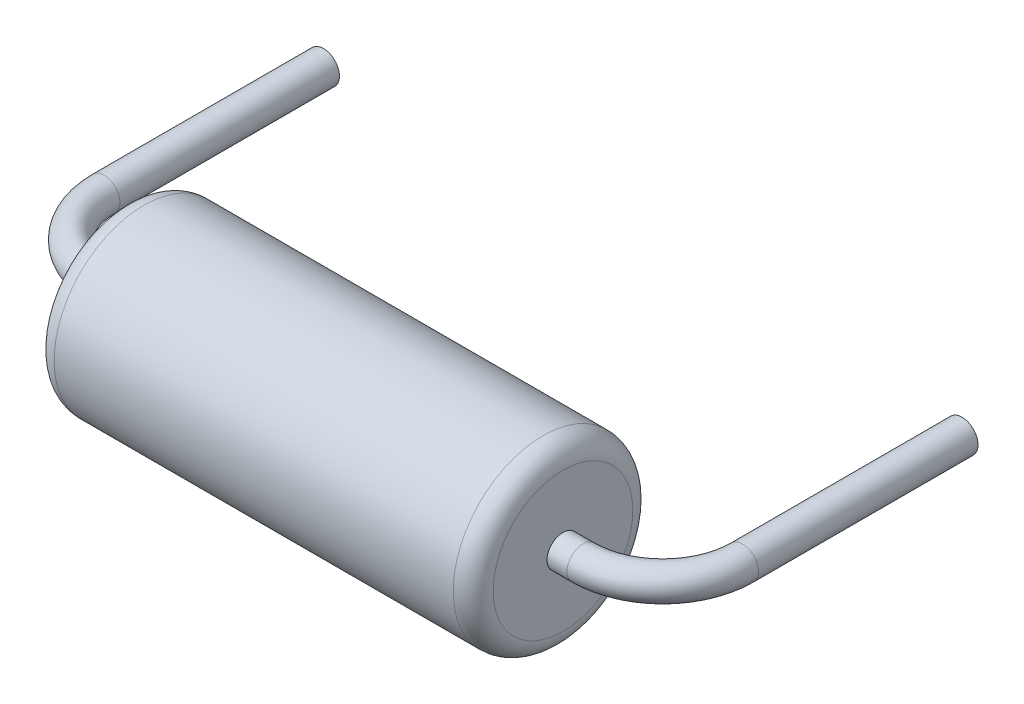
ISO-10303-21;
HEADER;
FILE_DESCRIPTION(('STEP AP214'),'2;1');
FILE_NAME('part.step','',(''),(''),'','','');
FILE_SCHEMA(('AUTOMOTIVE_DESIGN { 1 0 10303 214 1 1 1 1 }'));
ENDSEC;
DATA;
#1=APPLICATION_CONTEXT('core data for automotive mechanical design processes');
#2=APPLICATION_PROTOCOL_DEFINITION('international standard','automotive_design',2000,#1);
#3=PRODUCT_CONTEXT('',#1,'mechanical');
#4=PRODUCT('Part','Part','',(#3));
#5=PRODUCT_RELATED_PRODUCT_CATEGORY('part','',(#4));
#6=PRODUCT_DEFINITION_FORMATION('','',#4);
#7=PRODUCT_DEFINITION_CONTEXT('part definition',#1,'design');
#8=PRODUCT_DEFINITION('design','',#6,#7);
#9=PRODUCT_DEFINITION_SHAPE('','',#8);
#10=(LENGTH_UNIT() NAMED_UNIT(*) SI_UNIT(.MILLI.,.METRE.));
#11=(NAMED_UNIT(*) PLANE_ANGLE_UNIT() SI_UNIT($,.RADIAN.));
#12=(NAMED_UNIT(*) SI_UNIT($,.STERADIAN.) SOLID_ANGLE_UNIT());
#13=UNCERTAINTY_MEASURE_WITH_UNIT(LENGTH_MEASURE(1.E-05),#10,'distance_accuracy_value','');
#14=(GEOMETRIC_REPRESENTATION_CONTEXT(3) GLOBAL_UNCERTAINTY_ASSIGNED_CONTEXT((#13)) GLOBAL_UNIT_ASSIGNED_CONTEXT((#10,
#11,#12)) REPRESENTATION_CONTEXT('',''));
#15=CARTESIAN_POINT('',(0.,0.,0.));
#16=DIRECTION('',(0.,0.,1.));
#17=DIRECTION('',(1.,0.,0.));
#18=AXIS2_PLACEMENT_3D('',#15,#16,#17);
#19=CARTESIAN_POINT('',(13.5,0.,2.25));
#20=DIRECTION('',(-1.,0.,0.));
#21=DIRECTION('',(0.,0.,1.));
#22=AXIS2_PLACEMENT_3D('',#19,#20,#21);
#23=CYLINDRICAL_SURFACE('',#22,2.25);
#24=CARTESIAN_POINT('',(3.,0.,2.25));
#25=DIRECTION('',(1.,0.,0.));
#26=DIRECTION('',(0.,0.,-1.));
#27=AXIS2_PLACEMENT_3D('',#24,#25,#26);
#28=CIRCLE('',#27,2.25);
#29=CARTESIAN_POINT('',(3.,0.,0.));
#30=VERTEX_POINT('',#29);
#31=EDGE_CURVE('E40',#30,#30,#28,.T.);
#32=ORIENTED_EDGE('',*,*,#31,.T.);
#33=EDGE_LOOP('',(#32));
#34=FACE_BOUND('',#33,.T.);
#35=CARTESIAN_POINT('',(13.,0.,2.25));
#36=DIRECTION('',(1.,0.,0.));
#37=DIRECTION('',(0.,0.,-1.));
#38=AXIS2_PLACEMENT_3D('',#35,#36,#37);
#39=CIRCLE('',#38,2.25);
#40=CARTESIAN_POINT('',(13.,0.,0.));
#41=VERTEX_POINT('',#40);
#42=EDGE_CURVE('E44',#41,#41,#39,.F.);
#43=ORIENTED_EDGE('',*,*,#42,.T.);
#44=EDGE_LOOP('',(#43));
#45=FACE_BOUND('',#44,.T.);
#46=ADVANCED_FACE('F29',(#34,#45),#23,.T.);
#47=CARTESIAN_POINT('',(13.5,0.,2.25));
#48=DIRECTION('',(1.,0.,0.));
#49=DIRECTION('',(0.,0.,-1.));
#50=AXIS2_PLACEMENT_3D('',#47,#48,#49);
#51=PLANE('',#50);
#52=CARTESIAN_POINT('',(13.5,0.,2.25));
#53=DIRECTION('',(1.,0.,0.));
#54=DIRECTION('',(0.,0.,-1.));
#55=AXIS2_PLACEMENT_3D('',#52,#53,#54);
#56=CIRCLE('',#55,1.75);
#57=CARTESIAN_POINT('',(13.5,0.,0.5));
#58=VERTEX_POINT('',#57);
#59=EDGE_CURVE('E10',#58,#58,#56,.T.);
#60=ORIENTED_EDGE('',*,*,#59,.T.);
#61=EDGE_LOOP('',(#60));
#62=FACE_BOUND('',#61,.T.);
#63=CARTESIAN_POINT('',(13.5,0.,2.25));
#64=DIRECTION('',(1.,0.,0.));
#65=DIRECTION('',(0.,0.,-1.));
#66=AXIS2_PLACEMENT_3D('',#63,#64,#65);
#67=CIRCLE('',#66,0.4);
#68=CARTESIAN_POINT('',(13.5,0.,1.85));
#69=VERTEX_POINT('',#68);
#70=EDGE_CURVE('E49',#69,#69,#67,.T.);
#71=ORIENTED_EDGE('',*,*,#70,.F.);
#72=EDGE_LOOP('',(#71));
#73=FACE_BOUND('',#72,.T.);
#74=ADVANCED_FACE('F90',(#62,#73),#51,.T.);
#75=CARTESIAN_POINT('',(2.5,0.,2.25));
#76=DIRECTION('',(1.,0.,0.));
#77=DIRECTION('',(0.,0.,-1.));
#78=AXIS2_PLACEMENT_3D('',#75,#76,#77);
#79=PLANE('',#78);
#80=CARTESIAN_POINT('',(2.5,0.,2.25));
#81=DIRECTION('',(1.,0.,0.));
#82=DIRECTION('',(0.,0.,-1.));
#83=AXIS2_PLACEMENT_3D('',#80,#81,#82);
#84=CIRCLE('',#83,1.75);
#85=CARTESIAN_POINT('',(2.5,0.,0.5));
#86=VERTEX_POINT('',#85);
#87=EDGE_CURVE('E36',#86,#86,#84,.F.);
#88=ORIENTED_EDGE('',*,*,#87,.T.);
#89=EDGE_LOOP('',(#88));
#90=FACE_BOUND('',#89,.T.);
#91=CARTESIAN_POINT('',(2.5,0.,2.25));
#92=DIRECTION('',(1.,0.,0.));
#93=DIRECTION('',(0.,0.,-1.));
#94=AXIS2_PLACEMENT_3D('',#91,#92,#93);
#95=CIRCLE('',#94,0.4);
#96=CARTESIAN_POINT('',(2.5,0.,1.85));
#97=VERTEX_POINT('',#96);
#98=EDGE_CURVE('E50',#97,#97,#95,.T.);
#99=ORIENTED_EDGE('',*,*,#98,.T.);
#100=EDGE_LOOP('',(#99));
#101=FACE_BOUND('',#100,.T.);
#102=ADVANCED_FACE('F85',(#90,#101),#79,.F.);
#103=CARTESIAN_POINT('',(0.,0.,-5.25));
#104=DIRECTION('',(0.,0.,1.));
#105=DIRECTION('',(1.,0.,0.));
#106=AXIS2_PLACEMENT_3D('',#103,#104,#105);
#107=PLANE('',#106);
#108=CARTESIAN_POINT('',(0.,0.,-5.25));
#109=DIRECTION('',(0.,0.,1.));
#110=DIRECTION('',(1.,0.,0.));
#111=AXIS2_PLACEMENT_3D('',#108,#109,#110);
#112=CIRCLE('',#111,0.4);
#113=CARTESIAN_POINT('',(0.4,0.,-5.25));
#114=VERTEX_POINT('',#113);
#115=EDGE_CURVE('E68',#114,#114,#112,.T.);
#116=ORIENTED_EDGE('',*,*,#115,.F.);
#117=EDGE_LOOP('',(#116));
#118=FACE_BOUND('',#117,.T.);
#119=ADVANCED_FACE('F80',(#118),#107,.F.);
#120=CARTESIAN_POINT('',(0.,0.,0.25));
#121=DIRECTION('',(0.,0.,-1.));
#122=DIRECTION('',(-1.,0.,0.));
#123=AXIS2_PLACEMENT_3D('',#120,#121,#122);
#124=CYLINDRICAL_SURFACE('',#123,0.4);
#125=CARTESIAN_POINT('',(0.,0.,0.25));
#126=DIRECTION('',(0.,0.,1.));
#127=DIRECTION('',(1.,0.,0.));
#128=AXIS2_PLACEMENT_3D('',#125,#126,#127);
#129=CIRCLE('',#128,0.4);
#130=CARTESIAN_POINT('',(-0.399999999999999,0.,0.25));
#131=VERTEX_POINT('',#130);
#132=EDGE_CURVE('E67',#131,#131,#129,.T.);
#133=ORIENTED_EDGE('',*,*,#132,.F.);
#134=EDGE_LOOP('',(#133));
#135=FACE_BOUND('',#134,.T.);
#136=ORIENTED_EDGE('',*,*,#115,.T.);
#137=EDGE_LOOP('',(#136));
#138=FACE_BOUND('',#137,.T.);
#139=ADVANCED_FACE('F77',(#135,#138),#124,.T.);
#140=CARTESIAN_POINT('',(2.,0.,0.25));
#141=DIRECTION('',(0.,1.,0.));
#142=DIRECTION('',(0.,0.,1.));
#143=AXIS2_PLACEMENT_3D('',#140,#141,#142);
#144=TOROIDAL_SURFACE('',#143,2.,0.4);
#145=CARTESIAN_POINT('',(2.,0.,2.25));
#146=DIRECTION('',(1.,0.,0.));
#147=DIRECTION('',(0.,0.,-1.));
#148=AXIS2_PLACEMENT_3D('',#145,#146,#147);
#149=CIRCLE('',#148,0.4);
#150=CARTESIAN_POINT('',(2.,0.,2.65));
#151=VERTEX_POINT('',#150);
#152=EDGE_CURVE('E64',#151,#151,#149,.T.);
#153=CARTESIAN_POINT('',(2.,0.,0.25));
#154=DIRECTION('',(0.,1.,0.));
#155=DIRECTION('',(0.,0.,1.));
#156=AXIS2_PLACEMENT_3D('',#153,#154,#155);
#157=CIRCLE('',#156,2.4);
#158=EDGE_CURVE('',#131,#151,#157,.T.);
#159=ORIENTED_EDGE('',*,*,#132,.T.);
#160=ORIENTED_EDGE('',*,*,#152,.F.);
#161=ORIENTED_EDGE('',*,*,#158,.T.);
#162=ORIENTED_EDGE('',*,*,#158,.F.);
#163=EDGE_LOOP('',(#159,#161,#160,#162));
#164=FACE_BOUND('',#163,.T.);
#165=ADVANCED_FACE('F74',(#164),#144,.T.);
#166=CARTESIAN_POINT('',(2.,0.,2.25));
#167=DIRECTION('',(1.,0.,0.));
#168=DIRECTION('',(0.,0.,-1.));
#169=AXIS2_PLACEMENT_3D('',#166,#167,#168);
#170=CYLINDRICAL_SURFACE('',#169,0.4);
#171=ORIENTED_EDGE('',*,*,#152,.T.);
#172=EDGE_LOOP('',(#171));
#173=FACE_BOUND('',#172,.T.);
#174=ORIENTED_EDGE('',*,*,#98,.F.);
#175=EDGE_LOOP('',(#174));
#176=FACE_BOUND('',#175,.T.);
#177=ADVANCED_FACE('F120',(#173,#176),#170,.T.);
#178=CARTESIAN_POINT('',(16.,0.,0.249999999999999));
#179=DIRECTION('',(0.,0.,-1.));
#180=DIRECTION('',(-1.,0.,0.));
#181=AXIS2_PLACEMENT_3D('',#178,#179,#180);
#182=CYLINDRICAL_SURFACE('',#181,0.4);
#183=CARTESIAN_POINT('',(16.,0.,0.249999999999999));
#184=DIRECTION('',(0.,0.,-1.));
#185=DIRECTION('',(-1.,0.,0.));
#186=AXIS2_PLACEMENT_3D('',#183,#184,#185);
#187=CIRCLE('',#186,0.4);
#188=CARTESIAN_POINT('',(16.4,0.,0.249999999999999));
#189=VERTEX_POINT('',#188);
#190=EDGE_CURVE('E58',#189,#189,#187,.T.);
#191=ORIENTED_EDGE('',*,*,#190,.T.);
#192=EDGE_LOOP('',(#191));
#193=FACE_BOUND('',#192,.T.);
#194=CARTESIAN_POINT('',(16.,0.,-5.25));
#195=DIRECTION('',(0.,0.,-1.));
#196=DIRECTION('',(-1.,0.,0.));
#197=AXIS2_PLACEMENT_3D('',#194,#195,#196);
#198=CIRCLE('',#197,0.4);
#199=CARTESIAN_POINT('',(15.6,0.,-5.25));
#200=VERTEX_POINT('',#199);
#201=EDGE_CURVE('E53',#200,#200,#198,.T.);
#202=ORIENTED_EDGE('',*,*,#201,.F.);
#203=EDGE_LOOP('',(#202));
#204=FACE_BOUND('',#203,.T.);
#205=ADVANCED_FACE('F123',(#193,#204),#182,.T.);
#206=CARTESIAN_POINT('',(14.,0.,0.249999999999998));
#207=DIRECTION('',(0.,1.,0.));
#208=DIRECTION('',(0.,0.,1.));
#209=AXIS2_PLACEMENT_3D('',#206,#207,#208);
#210=TOROIDAL_SURFACE('',#209,2.,0.4);
#211=CARTESIAN_POINT('',(14.,0.,2.25));
#212=DIRECTION('',(1.,0.,0.));
#213=DIRECTION('',(0.,0.,-1.));
#214=AXIS2_PLACEMENT_3D('',#211,#212,#213);
#215=CIRCLE('',#214,0.4);
#216=CARTESIAN_POINT('',(14.,0.,2.65));
#217=VERTEX_POINT('',#216);
#218=EDGE_CURVE('E61',#217,#217,#215,.T.);
#219=CARTESIAN_POINT('',(14.,0.,0.249999999999998));
#220=DIRECTION('',(0.,1.,0.));
#221=DIRECTION('',(0.,0.,1.));
#222=AXIS2_PLACEMENT_3D('',#219,#220,#221);
#223=CIRCLE('',#222,2.4);
#224=EDGE_CURVE('',#217,#189,#223,.T.);
#225=ORIENTED_EDGE('',*,*,#218,.T.);
#226=ORIENTED_EDGE('',*,*,#190,.F.);
#227=ORIENTED_EDGE('',*,*,#224,.T.);
#228=ORIENTED_EDGE('',*,*,#224,.F.);
#229=EDGE_LOOP('',(#225,#227,#226,#228));
#230=FACE_BOUND('',#229,.T.);
#231=ADVANCED_FACE('F117',(#230),#210,.T.);
#232=ORIENTED_EDGE('',*,*,#70,.T.);
#233=EDGE_LOOP('',(#232));
#234=FACE_BOUND('',#233,.T.);
#235=ORIENTED_EDGE('',*,*,#218,.F.);
#236=EDGE_LOOP('',(#235));
#237=FACE_BOUND('',#236,.T.);
#238=ADVANCED_FACE('F110',(#234,#237),#170,.T.);
#239=CARTESIAN_POINT('',(16.,0.,-5.25));
#240=DIRECTION('',(0.,0.,-1.));
#241=DIRECTION('',(-1.,0.,0.));
#242=AXIS2_PLACEMENT_3D('',#239,#240,#241);
#243=PLANE('',#242);
#244=ORIENTED_EDGE('',*,*,#201,.T.);
#245=EDGE_LOOP('',(#244));
#246=FACE_BOUND('',#245,.T.);
#247=ADVANCED_FACE('F103',(#246),#243,.T.);
#248=CARTESIAN_POINT('',(3.,0.,2.25));
#249=DIRECTION('',(1.,0.,0.));
#250=DIRECTION('',(0.,0.,-1.));
#251=AXIS2_PLACEMENT_3D('',#248,#249,#250);
#252=TOROIDAL_SURFACE('',#251,1.75,0.5);
#253=ORIENTED_EDGE('',*,*,#87,.F.);
#254=EDGE_LOOP('',(#253));
#255=FACE_BOUND('',#254,.T.);
#256=ORIENTED_EDGE('',*,*,#31,.F.);
#257=EDGE_LOOP('',(#256));
#258=FACE_BOUND('',#257,.T.);
#259=ADVANCED_FACE('F101',(#255,#258),#252,.T.);
#260=CARTESIAN_POINT('',(13.,0.,2.25));
#261=DIRECTION('',(1.,0.,0.));
#262=DIRECTION('',(0.,0.,-1.));
#263=AXIS2_PLACEMENT_3D('',#260,#261,#262);
#264=TOROIDAL_SURFACE('',#263,1.75,0.5);
#265=ORIENTED_EDGE('',*,*,#42,.F.);
#266=EDGE_LOOP('',(#265));
#267=FACE_BOUND('',#266,.T.);
#268=ORIENTED_EDGE('',*,*,#59,.F.);
#269=EDGE_LOOP('',(#268));
#270=FACE_BOUND('',#269,.T.);
#271=ADVANCED_FACE('F31',(#267,#270),#264,.T.);
#272=CLOSED_SHELL('',(#46,#74,#102,#119,#139,#165,#177,#205,#231,#238,#247,#259,#271));
#273=MANIFOLD_SOLID_BREP('B2',#272);
#274=ADVANCED_BREP_SHAPE_REPRESENTATION('',(#18,#273),#14);
#275=SHAPE_DEFINITION_REPRESENTATION(#9,#274);
ENDSEC;
END-ISO-10303-21;
